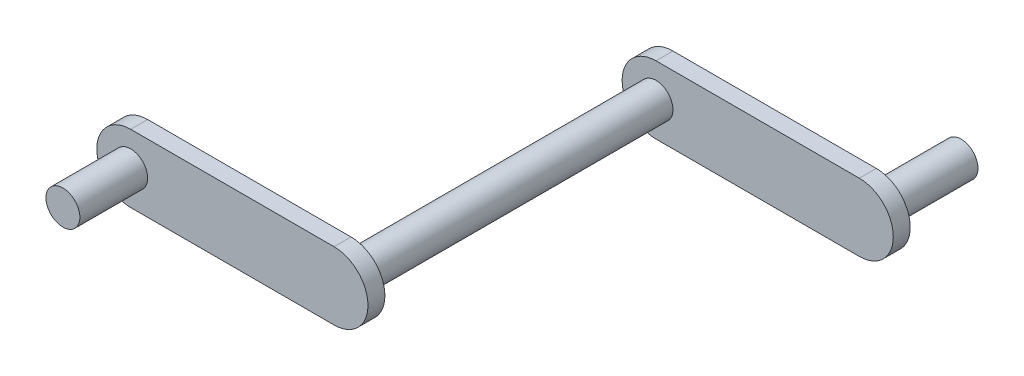
ISO-10303-21;
HEADER;
FILE_DESCRIPTION(('STEP AP214'),'2;1');
FILE_NAME('part.step','',(''),(''),'','','');
FILE_SCHEMA(('AUTOMOTIVE_DESIGN { 1 0 10303 214 1 1 1 1 }'));
ENDSEC;
DATA;
#1=APPLICATION_CONTEXT('core data for automotive mechanical design processes');
#2=APPLICATION_PROTOCOL_DEFINITION('international standard','automotive_design',2000,#1);
#3=PRODUCT_CONTEXT('',#1,'mechanical');
#4=PRODUCT('Part','Part','',(#3));
#5=PRODUCT_RELATED_PRODUCT_CATEGORY('part','',(#4));
#6=PRODUCT_DEFINITION_FORMATION('','',#4);
#7=PRODUCT_DEFINITION_CONTEXT('part definition',#1,'design');
#8=PRODUCT_DEFINITION('design','',#6,#7);
#9=PRODUCT_DEFINITION_SHAPE('','',#8);
#10=(LENGTH_UNIT() NAMED_UNIT(*) SI_UNIT(.MILLI.,.METRE.));
#11=(NAMED_UNIT(*) PLANE_ANGLE_UNIT() SI_UNIT($,.RADIAN.));
#12=(NAMED_UNIT(*) SI_UNIT($,.STERADIAN.) SOLID_ANGLE_UNIT());
#13=UNCERTAINTY_MEASURE_WITH_UNIT(LENGTH_MEASURE(1.E-05),#10,'distance_accuracy_value','');
#14=(GEOMETRIC_REPRESENTATION_CONTEXT(3) GLOBAL_UNCERTAINTY_ASSIGNED_CONTEXT((#13)) GLOBAL_UNIT_ASSIGNED_CONTEXT((#10,
#11,#12)) REPRESENTATION_CONTEXT('',''));
#15=CARTESIAN_POINT('',(0.,0.,0.));
#16=DIRECTION('',(0.,0.,1.));
#17=DIRECTION('',(1.,0.,0.));
#18=AXIS2_PLACEMENT_3D('',#15,#16,#17);
#19=CARTESIAN_POINT('',(-190.5,0.157439451623581,15.875));
#20=DIRECTION('',(0.,0.,1.));
#21=DIRECTION('',(1.,0.,0.));
#22=AXIS2_PLACEMENT_3D('',#19,#20,#21);
#23=PLANE('',#22);
#24=CARTESIAN_POINT('',(-190.5,0.157439451623581,15.875));
#25=DIRECTION('',(0.,0.,1.));
#26=DIRECTION('',(1.,0.,0.));
#27=AXIS2_PLACEMENT_3D('',#24,#25,#26);
#28=CIRCLE('',#27,63.5);
#29=CARTESIAN_POINT('',(-190.5,63.6574394516236,15.875));
#30=VERTEX_POINT('',#29);
#31=CARTESIAN_POINT('',(-190.5,-63.3425605483764,15.875));
#32=VERTEX_POINT('',#31);
#33=EDGE_CURVE('E154',#30,#32,#28,.T.);
#34=ORIENTED_EDGE('',*,*,#33,.T.);
#35=DIRECTION('',(1.,0.,0.));
#36=VECTOR('',#35,1.);
#37=CARTESIAN_POINT('',(-190.5,-63.3425605483764,15.875));
#38=LINE('',#37,#36);
#39=CARTESIAN_POINT('',(190.5,-63.3425605483764,15.875));
#40=VERTEX_POINT('',#39);
#41=EDGE_CURVE('E85',#32,#40,#38,.T.);
#42=ORIENTED_EDGE('',*,*,#41,.T.);
#43=CARTESIAN_POINT('',(190.5,0.157439451623581,15.875));
#44=DIRECTION('',(0.,0.,1.));
#45=DIRECTION('',(1.,0.,0.));
#46=AXIS2_PLACEMENT_3D('',#43,#44,#45);
#47=CIRCLE('',#46,63.5);
#48=CARTESIAN_POINT('',(190.5,63.6574394516236,15.875));
#49=VERTEX_POINT('',#48);
#50=EDGE_CURVE('E157',#40,#49,#47,.T.);
#51=ORIENTED_EDGE('',*,*,#50,.T.);
#52=DIRECTION('',(-1.,0.,0.));
#53=VECTOR('',#52,1.);
#54=CARTESIAN_POINT('',(-190.5,63.6574394516236,15.875));
#55=LINE('',#54,#53);
#56=EDGE_CURVE('E54',#49,#30,#55,.T.);
#57=ORIENTED_EDGE('',*,*,#56,.T.);
#58=EDGE_LOOP('',(#34,#42,#51,#57));
#59=FACE_BOUND('',#58,.T.);
#60=CARTESIAN_POINT('',(-190.5,0.157439451623581,15.875));
#61=DIRECTION('',(0.,0.,1.));
#62=DIRECTION('',(1.,0.,0.));
#63=AXIS2_PLACEMENT_3D('',#60,#61,#62);
#64=CIRCLE('',#63,31.75);
#65=CARTESIAN_POINT('',(-158.75,0.157439451623581,15.875));
#66=VERTEX_POINT('',#65);
#67=EDGE_CURVE('E147',#66,#66,#64,.T.);
#68=ORIENTED_EDGE('',*,*,#67,.F.);
#69=EDGE_LOOP('',(#68));
#70=FACE_BOUND('',#69,.T.);
#71=ADVANCED_FACE('F37',(#59,#70),#23,.T.);
#72=CARTESIAN_POINT('',(-190.5,0.157439451623581,-15.875));
#73=DIRECTION('',(0.,0.,1.));
#74=DIRECTION('',(1.,0.,0.));
#75=AXIS2_PLACEMENT_3D('',#72,#73,#74);
#76=PLANE('',#75);
#77=CARTESIAN_POINT('',(-190.5,0.157439451623581,-15.875));
#78=DIRECTION('',(0.,0.,1.));
#79=DIRECTION('',(1.,0.,0.));
#80=AXIS2_PLACEMENT_3D('',#77,#78,#79);
#81=CIRCLE('',#80,63.5);
#82=CARTESIAN_POINT('',(-190.5,63.6574394516236,-15.875));
#83=VERTEX_POINT('',#82);
#84=CARTESIAN_POINT('',(-190.5,-63.3425605483764,-15.875));
#85=VERTEX_POINT('',#84);
#86=EDGE_CURVE('E151',#83,#85,#81,.T.);
#87=ORIENTED_EDGE('',*,*,#86,.F.);
#88=DIRECTION('',(-1.,0.,0.));
#89=VECTOR('',#88,1.);
#90=CARTESIAN_POINT('',(-190.5,63.6574394516236,-15.875));
#91=LINE('',#90,#89);
#92=CARTESIAN_POINT('',(190.5,63.6574394516236,-15.875));
#93=VERTEX_POINT('',#92);
#94=EDGE_CURVE('E78',#93,#83,#91,.T.);
#95=ORIENTED_EDGE('',*,*,#94,.F.);
#96=CARTESIAN_POINT('',(190.5,0.157439451623581,-15.875));
#97=DIRECTION('',(0.,0.,1.));
#98=DIRECTION('',(1.,0.,0.));
#99=AXIS2_PLACEMENT_3D('',#96,#97,#98);
#100=CIRCLE('',#99,63.5);
#101=CARTESIAN_POINT('',(190.5,-63.3425605483764,-15.875));
#102=VERTEX_POINT('',#101);
#103=EDGE_CURVE('E72',#102,#93,#100,.T.);
#104=ORIENTED_EDGE('',*,*,#103,.F.);
#105=DIRECTION('',(1.,0.,0.));
#106=VECTOR('',#105,1.);
#107=CARTESIAN_POINT('',(-190.5,-63.3425605483764,-15.875));
#108=LINE('',#107,#106);
#109=EDGE_CURVE('E163',#85,#102,#108,.T.);
#110=ORIENTED_EDGE('',*,*,#109,.F.);
#111=EDGE_LOOP('',(#87,#95,#104,#110));
#112=FACE_BOUND('',#111,.T.);
#113=CARTESIAN_POINT('',(190.5,0.157439451623581,-15.875));
#114=DIRECTION('',(0.,0.,1.));
#115=DIRECTION('',(1.,0.,0.));
#116=AXIS2_PLACEMENT_3D('',#113,#114,#115);
#117=CIRCLE('',#116,31.75);
#118=CARTESIAN_POINT('',(222.25,0.157439451623581,-15.875));
#119=VERTEX_POINT('',#118);
#120=EDGE_CURVE('E139',#119,#119,#117,.T.);
#121=ORIENTED_EDGE('',*,*,#120,.T.);
#122=EDGE_LOOP('',(#121));
#123=FACE_BOUND('',#122,.T.);
#124=ADVANCED_FACE('F173',(#112,#123),#76,.F.);
#125=CARTESIAN_POINT('',(-190.5,0.157439451623581,15.875));
#126=DIRECTION('',(0.,0.,-1.));
#127=DIRECTION('',(-1.,0.,0.));
#128=AXIS2_PLACEMENT_3D('',#125,#126,#127);
#129=CYLINDRICAL_SURFACE('',#128,63.5);
#130=ORIENTED_EDGE('',*,*,#86,.T.);
#131=DIRECTION('',(0.,0.,-1.));
#132=VECTOR('',#131,1.);
#133=CARTESIAN_POINT('',(-190.5,-63.3425605483764,15.875));
#134=LINE('',#133,#132);
#135=EDGE_CURVE('E11',#32,#85,#134,.T.);
#136=ORIENTED_EDGE('',*,*,#135,.F.);
#137=ORIENTED_EDGE('',*,*,#33,.F.);
#138=DIRECTION('',(0.,0.,-1.));
#139=VECTOR('',#138,1.);
#140=CARTESIAN_POINT('',(-190.5,63.6574394516236,15.875));
#141=LINE('',#140,#139);
#142=EDGE_CURVE('E160',#30,#83,#141,.T.);
#143=ORIENTED_EDGE('',*,*,#142,.T.);
#144=EDGE_LOOP('',(#130,#136,#137,#143));
#145=FACE_BOUND('',#144,.T.);
#146=ADVANCED_FACE('F39',(#145),#129,.T.);
#147=CARTESIAN_POINT('',(-190.5,-63.3425605483764,15.875));
#148=DIRECTION('',(0.,1.,0.));
#149=DIRECTION('',(0.,0.,1.));
#150=AXIS2_PLACEMENT_3D('',#147,#148,#149);
#151=PLANE('',#150);
#152=ORIENTED_EDGE('',*,*,#109,.T.);
#153=DIRECTION('',(0.,0.,-1.));
#154=VECTOR('',#153,1.);
#155=CARTESIAN_POINT('',(190.5,-63.3425605483764,15.875));
#156=LINE('',#155,#154);
#157=EDGE_CURVE('E46',#40,#102,#156,.T.);
#158=ORIENTED_EDGE('',*,*,#157,.F.);
#159=ORIENTED_EDGE('',*,*,#41,.F.);
#160=ORIENTED_EDGE('',*,*,#135,.T.);
#161=EDGE_LOOP('',(#152,#158,#159,#160));
#162=FACE_BOUND('',#161,.T.);
#163=ADVANCED_FACE('F189',(#162),#151,.F.);
#164=CARTESIAN_POINT('',(190.5,0.157439451623581,15.875));
#165=DIRECTION('',(0.,0.,-1.));
#166=DIRECTION('',(-1.,0.,0.));
#167=AXIS2_PLACEMENT_3D('',#164,#165,#166);
#168=CYLINDRICAL_SURFACE('',#167,63.5);
#169=ORIENTED_EDGE('',*,*,#103,.T.);
#170=DIRECTION('',(0.,0.,-1.));
#171=VECTOR('',#170,1.);
#172=CARTESIAN_POINT('',(190.5,63.6574394516236,15.875));
#173=LINE('',#172,#171);
#174=EDGE_CURVE('E168',#49,#93,#173,.T.);
#175=ORIENTED_EDGE('',*,*,#174,.F.);
#176=ORIENTED_EDGE('',*,*,#50,.F.);
#177=ORIENTED_EDGE('',*,*,#157,.T.);
#178=EDGE_LOOP('',(#169,#175,#176,#177));
#179=FACE_BOUND('',#178,.T.);
#180=ADVANCED_FACE('F170',(#179),#168,.T.);
#181=CARTESIAN_POINT('',(-190.5,63.6574394516236,15.875));
#182=DIRECTION('',(0.,-1.,0.));
#183=DIRECTION('',(0.,0.,-1.));
#184=AXIS2_PLACEMENT_3D('',#181,#182,#183);
#185=PLANE('',#184);
#186=ORIENTED_EDGE('',*,*,#94,.T.);
#187=ORIENTED_EDGE('',*,*,#142,.F.);
#188=ORIENTED_EDGE('',*,*,#56,.F.);
#189=ORIENTED_EDGE('',*,*,#174,.T.);
#190=EDGE_LOOP('',(#186,#187,#188,#189));
#191=FACE_BOUND('',#190,.T.);
#192=ADVANCED_FACE('F178',(#191),#185,.F.);
#193=CARTESIAN_POINT('',(-190.5,0.157439451623581,587.375));
#194=DIRECTION('',(0.,0.,-1.));
#195=DIRECTION('',(-1.,0.,0.));
#196=AXIS2_PLACEMENT_3D('',#193,#194,#195);
#197=CYLINDRICAL_SURFACE('',#196,31.75);
#198=CARTESIAN_POINT('',(-190.5,0.157439451623581,587.375));
#199=DIRECTION('',(0.,0.,1.));
#200=DIRECTION('',(1.,0.,0.));
#201=AXIS2_PLACEMENT_3D('',#198,#199,#200);
#202=CIRCLE('',#201,31.75);
#203=CARTESIAN_POINT('',(-158.75,0.157439451623581,587.375));
#204=VERTEX_POINT('',#203);
#205=EDGE_CURVE('E148',#204,#204,#202,.T.);
#206=ORIENTED_EDGE('',*,*,#205,.F.);
#207=EDGE_LOOP('',(#206));
#208=FACE_BOUND('',#207,.T.);
#209=ORIENTED_EDGE('',*,*,#67,.T.);
#210=EDGE_LOOP('',(#209));
#211=FACE_BOUND('',#210,.T.);
#212=ADVANCED_FACE('F180',(#208,#211),#197,.T.);
#213=CARTESIAN_POINT('',(190.5,0.157439451623581,-174.625));
#214=DIRECTION('',(0.,0.,1.));
#215=DIRECTION('',(1.,0.,0.));
#216=AXIS2_PLACEMENT_3D('',#213,#214,#215);
#217=CYLINDRICAL_SURFACE('',#216,31.75);
#218=CARTESIAN_POINT('',(190.5,0.157439451623581,-174.625));
#219=DIRECTION('',(0.,0.,1.));
#220=DIRECTION('',(1.,0.,0.));
#221=AXIS2_PLACEMENT_3D('',#218,#219,#220);
#222=CIRCLE('',#221,31.75);
#223=CARTESIAN_POINT('',(222.25,0.157439451623581,-174.625));
#224=VERTEX_POINT('',#223);
#225=EDGE_CURVE('E136',#224,#224,#222,.T.);
#226=ORIENTED_EDGE('',*,*,#225,.T.);
#227=EDGE_LOOP('',(#226));
#228=FACE_BOUND('',#227,.T.);
#229=ORIENTED_EDGE('',*,*,#120,.F.);
#230=EDGE_LOOP('',(#229));
#231=FACE_BOUND('',#230,.T.);
#232=ADVANCED_FACE('F186',(#228,#231),#217,.T.);
#233=CARTESIAN_POINT('',(190.5,0.157439451623581,-174.625));
#234=DIRECTION('',(0.,0.,1.));
#235=DIRECTION('',(1.,0.,0.));
#236=AXIS2_PLACEMENT_3D('',#233,#234,#235);
#237=PLANE('',#236);
#238=ORIENTED_EDGE('',*,*,#225,.F.);
#239=EDGE_LOOP('',(#238));
#240=FACE_BOUND('',#239,.T.);
#241=ADVANCED_FACE('F201',(#240),#237,.F.);
#242=CARTESIAN_POINT('',(-571.5,0.157439451623581,619.125));
#243=DIRECTION('',(0.,0.,-1.));
#244=DIRECTION('',(-1.,0.,0.));
#245=AXIS2_PLACEMENT_3D('',#242,#243,#244);
#246=CYLINDRICAL_SURFACE('',#245,63.5);
#247=CARTESIAN_POINT('',(-571.5,0.157439451623581,587.375));
#248=DIRECTION('',(0.,0.,1.));
#249=DIRECTION('',(1.,0.,0.));
#250=AXIS2_PLACEMENT_3D('',#247,#248,#249);
#251=CIRCLE('',#250,63.5);
#252=CARTESIAN_POINT('',(-571.5,63.6574394516236,587.375));
#253=VERTEX_POINT('',#252);
#254=CARTESIAN_POINT('',(-571.5,-63.3425605483764,587.375));
#255=VERTEX_POINT('',#254);
#256=EDGE_CURVE('E135',#253,#255,#251,.T.);
#257=ORIENTED_EDGE('',*,*,#256,.T.);
#258=DIRECTION('',(0.,0.,-1.));
#259=VECTOR('',#258,1.);
#260=CARTESIAN_POINT('',(-571.5,-63.3425605483764,619.125));
#261=LINE('',#260,#259);
#262=CARTESIAN_POINT('',(-571.5,-63.3425605483764,619.125));
#263=VERTEX_POINT('',#262);
#264=EDGE_CURVE('E116',#263,#255,#261,.T.);
#265=ORIENTED_EDGE('',*,*,#264,.F.);
#266=CARTESIAN_POINT('',(-571.5,0.157439451623581,619.125));
#267=DIRECTION('',(0.,0.,1.));
#268=DIRECTION('',(1.,0.,0.));
#269=AXIS2_PLACEMENT_3D('',#266,#267,#268);
#270=CIRCLE('',#269,63.5);
#271=CARTESIAN_POINT('',(-571.5,63.6574394516236,619.125));
#272=VERTEX_POINT('',#271);
#273=EDGE_CURVE('E123',#272,#263,#270,.T.);
#274=ORIENTED_EDGE('',*,*,#273,.F.);
#275=DIRECTION('',(0.,0.,-1.));
#276=VECTOR('',#275,1.);
#277=CARTESIAN_POINT('',(-571.5,63.6574394516236,619.125));
#278=LINE('',#277,#276);
#279=EDGE_CURVE('E245',#272,#253,#278,.T.);
#280=ORIENTED_EDGE('',*,*,#279,.T.);
#281=EDGE_LOOP('',(#257,#265,#274,#280));
#282=FACE_BOUND('',#281,.T.);
#283=ADVANCED_FACE('F133',(#282),#246,.T.);
#284=CARTESIAN_POINT('',(-571.5,-63.3425605483764,619.125));
#285=DIRECTION('',(0.,1.,0.));
#286=DIRECTION('',(0.,0.,1.));
#287=AXIS2_PLACEMENT_3D('',#284,#285,#286);
#288=PLANE('',#287);
#289=DIRECTION('',(1.,0.,0.));
#290=VECTOR('',#289,1.);
#291=CARTESIAN_POINT('',(-571.5,-63.3425605483764,587.375));
#292=LINE('',#291,#290);
#293=CARTESIAN_POINT('',(-190.5,-63.3425605483764,587.375));
#294=VERTEX_POINT('',#293);
#295=EDGE_CURVE('E239',#255,#294,#292,.T.);
#296=ORIENTED_EDGE('',*,*,#295,.T.);
#297=DIRECTION('',(0.,0.,-1.));
#298=VECTOR('',#297,1.);
#299=CARTESIAN_POINT('',(-190.5,-63.3425605483764,619.125));
#300=LINE('',#299,#298);
#301=CARTESIAN_POINT('',(-190.5,-63.3425605483764,619.125));
#302=VERTEX_POINT('',#301);
#303=EDGE_CURVE('E119',#302,#294,#300,.T.);
#304=ORIENTED_EDGE('',*,*,#303,.F.);
#305=DIRECTION('',(1.,0.,0.));
#306=VECTOR('',#305,1.);
#307=CARTESIAN_POINT('',(-571.5,-63.3425605483764,619.125));
#308=LINE('',#307,#306);
#309=EDGE_CURVE('E112',#263,#302,#308,.T.);
#310=ORIENTED_EDGE('',*,*,#309,.F.);
#311=ORIENTED_EDGE('',*,*,#264,.T.);
#312=EDGE_LOOP('',(#296,#304,#310,#311));
#313=FACE_BOUND('',#312,.T.);
#314=ADVANCED_FACE('F114',(#313),#288,.F.);
#315=CARTESIAN_POINT('',(-190.5,0.157439451623581,619.125));
#316=DIRECTION('',(0.,0.,-1.));
#317=DIRECTION('',(-1.,0.,0.));
#318=AXIS2_PLACEMENT_3D('',#315,#316,#317);
#319=CYLINDRICAL_SURFACE('',#318,63.5);
#320=CARTESIAN_POINT('',(-190.5,0.157439451623581,587.375));
#321=DIRECTION('',(0.,0.,1.));
#322=DIRECTION('',(1.,0.,0.));
#323=AXIS2_PLACEMENT_3D('',#320,#321,#322);
#324=CIRCLE('',#323,63.5);
#325=CARTESIAN_POINT('',(-190.5,63.6574394516236,587.375));
#326=VERTEX_POINT('',#325);
#327=EDGE_CURVE('E248',#294,#326,#324,.T.);
#328=ORIENTED_EDGE('',*,*,#327,.T.);
#329=DIRECTION('',(0.,0.,-1.));
#330=VECTOR('',#329,1.);
#331=CARTESIAN_POINT('',(-190.5,63.6574394516236,619.125));
#332=LINE('',#331,#330);
#333=CARTESIAN_POINT('',(-190.5,63.6574394516236,619.125));
#334=VERTEX_POINT('',#333);
#335=EDGE_CURVE('E141',#334,#326,#332,.T.);
#336=ORIENTED_EDGE('',*,*,#335,.F.);
#337=CARTESIAN_POINT('',(-190.5,0.157439451623581,619.125));
#338=DIRECTION('',(0.,0.,1.));
#339=DIRECTION('',(1.,0.,0.));
#340=AXIS2_PLACEMENT_3D('',#337,#338,#339);
#341=CIRCLE('',#340,63.5);
#342=EDGE_CURVE('E122',#302,#334,#341,.T.);
#343=ORIENTED_EDGE('',*,*,#342,.F.);
#344=ORIENTED_EDGE('',*,*,#303,.T.);
#345=EDGE_LOOP('',(#328,#336,#343,#344));
#346=FACE_BOUND('',#345,.T.);
#347=ADVANCED_FACE('F210',(#346),#319,.T.);
#348=CARTESIAN_POINT('',(-571.5,63.6574394516236,619.125));
#349=DIRECTION('',(0.,1.,0.));
#350=DIRECTION('',(0.,0.,1.));
#351=AXIS2_PLACEMENT_3D('',#348,#349,#350);
#352=PLANE('',#351);
#353=DIRECTION('',(1.,0.,0.));
#354=VECTOR('',#353,1.);
#355=CARTESIAN_POINT('',(-571.5,63.6574394516236,587.375));
#356=LINE('',#355,#354);
#357=EDGE_CURVE('E131',#253,#326,#356,.T.);
#358=ORIENTED_EDGE('',*,*,#357,.F.);
#359=ORIENTED_EDGE('',*,*,#279,.F.);
#360=DIRECTION('',(1.,0.,0.));
#361=VECTOR('',#360,1.);
#362=CARTESIAN_POINT('',(-571.5,63.6574394516236,619.125));
#363=LINE('',#362,#361);
#364=EDGE_CURVE('E129',#272,#334,#363,.T.);
#365=ORIENTED_EDGE('',*,*,#364,.T.);
#366=ORIENTED_EDGE('',*,*,#335,.T.);
#367=EDGE_LOOP('',(#358,#359,#365,#366));
#368=FACE_BOUND('',#367,.T.);
#369=ADVANCED_FACE('F213',(#368),#352,.T.);
#370=CARTESIAN_POINT('',(-571.5,0.157439451623581,619.125));
#371=DIRECTION('',(0.,0.,1.));
#372=DIRECTION('',(1.,0.,0.));
#373=AXIS2_PLACEMENT_3D('',#370,#371,#372);
#374=PLANE('',#373);
#375=CARTESIAN_POINT('',(-571.5,0.157439451623581,619.125));
#376=DIRECTION('',(0.,0.,1.));
#377=DIRECTION('',(1.,0.,0.));
#378=AXIS2_PLACEMENT_3D('',#375,#376,#377);
#379=CIRCLE('',#378,31.7499999999999);
#380=CARTESIAN_POINT('',(-539.75,0.157439451623581,619.125));
#381=VERTEX_POINT('',#380);
#382=EDGE_CURVE('E237',#381,#381,#379,.T.);
#383=ORIENTED_EDGE('',*,*,#382,.F.);
#384=EDGE_LOOP('',(#383));
#385=FACE_BOUND('',#384,.T.);
#386=ORIENTED_EDGE('',*,*,#273,.T.);
#387=ORIENTED_EDGE('',*,*,#309,.T.);
#388=ORIENTED_EDGE('',*,*,#342,.T.);
#389=ORIENTED_EDGE('',*,*,#364,.F.);
#390=EDGE_LOOP('',(#386,#387,#388,#389));
#391=FACE_BOUND('',#390,.T.);
#392=ADVANCED_FACE('F127',(#385,#391),#374,.T.);
#393=CARTESIAN_POINT('',(-571.5,0.157439451623581,587.375));
#394=DIRECTION('',(0.,0.,1.));
#395=DIRECTION('',(1.,0.,0.));
#396=AXIS2_PLACEMENT_3D('',#393,#394,#395);
#397=PLANE('',#396);
#398=ORIENTED_EDGE('',*,*,#205,.T.);
#399=EDGE_LOOP('',(#398));
#400=FACE_BOUND('',#399,.T.);
#401=ORIENTED_EDGE('',*,*,#256,.F.);
#402=ORIENTED_EDGE('',*,*,#357,.T.);
#403=ORIENTED_EDGE('',*,*,#327,.F.);
#404=ORIENTED_EDGE('',*,*,#295,.F.);
#405=EDGE_LOOP('',(#401,#402,#403,#404));
#406=FACE_BOUND('',#405,.T.);
#407=ADVANCED_FACE('F218',(#400,#406),#397,.F.);
#408=CARTESIAN_POINT('',(-571.5,0.157439451623581,746.125));
#409=DIRECTION('',(0.,0.,-1.));
#410=DIRECTION('',(-1.,0.,0.));
#411=AXIS2_PLACEMENT_3D('',#408,#409,#410);
#412=CYLINDRICAL_SURFACE('',#411,31.7499999999999);
#413=CARTESIAN_POINT('',(-571.5,0.157439451623581,746.125));
#414=DIRECTION('',(0.,0.,1.));
#415=DIRECTION('',(1.,0.,0.));
#416=AXIS2_PLACEMENT_3D('',#413,#414,#415);
#417=CIRCLE('',#416,31.7499999999999);
#418=CARTESIAN_POINT('',(-539.75,0.157439451623581,746.125));
#419=VERTEX_POINT('',#418);
#420=EDGE_CURVE('E236',#419,#419,#417,.T.);
#421=ORIENTED_EDGE('',*,*,#420,.F.);
#422=EDGE_LOOP('',(#421));
#423=FACE_BOUND('',#422,.T.);
#424=ORIENTED_EDGE('',*,*,#382,.T.);
#425=EDGE_LOOP('',(#424));
#426=FACE_BOUND('',#425,.T.);
#427=ADVANCED_FACE('F221',(#423,#426),#412,.T.);
#428=CARTESIAN_POINT('',(-571.5,0.157439451623581,746.125));
#429=DIRECTION('',(0.,0.,1.));
#430=DIRECTION('',(1.,0.,0.));
#431=AXIS2_PLACEMENT_3D('',#428,#429,#430);
#432=PLANE('',#431);
#433=ORIENTED_EDGE('',*,*,#420,.T.);
#434=EDGE_LOOP('',(#433));
#435=FACE_BOUND('',#434,.T.);
#436=ADVANCED_FACE('F228',(#435),#432,.T.);
#437=CLOSED_SHELL('',(#71,#124,#146,#163,#180,#192,#212,#232,#241,#283,#314,#347,#369,#392,#407,
#427,#436));
#438=MANIFOLD_SOLID_BREP('B2',#437);
#439=ADVANCED_BREP_SHAPE_REPRESENTATION('',(#18,#438),#14);
#440=SHAPE_DEFINITION_REPRESENTATION(#9,#439);
ENDSEC;
END-ISO-10303-21;
